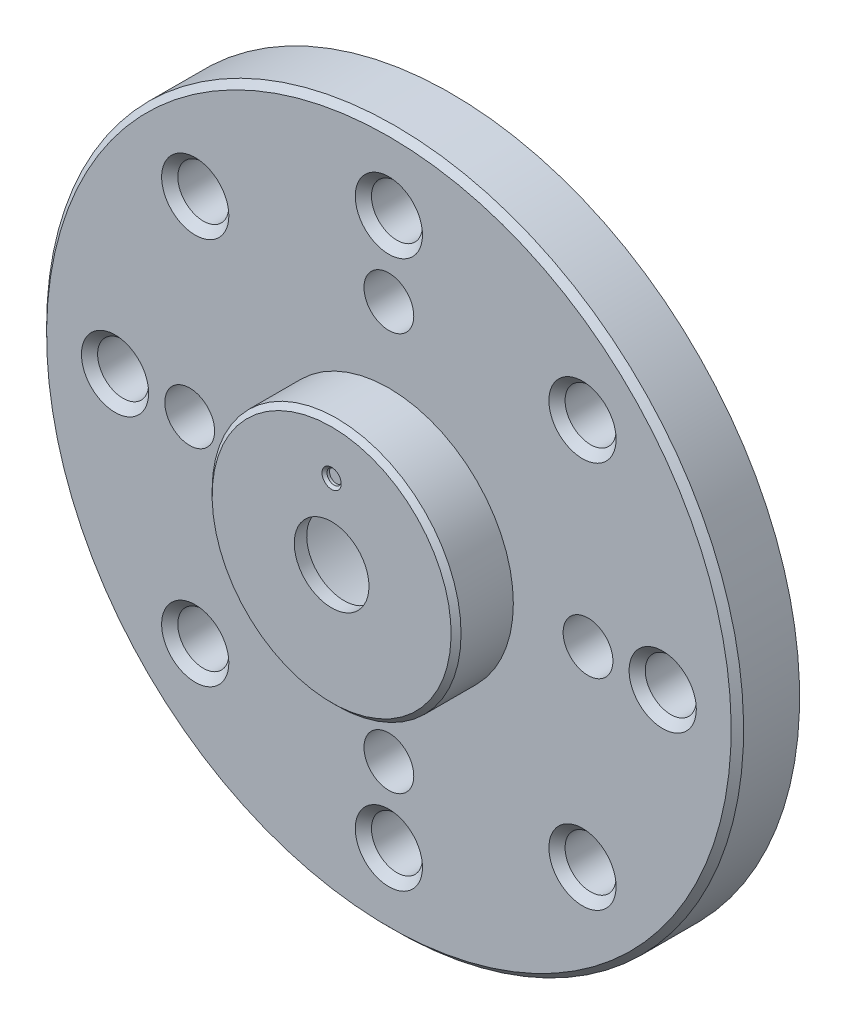
ISO-10303-21;
HEADER;
FILE_DESCRIPTION(('STEP AP214'),'2;1');
FILE_NAME('part.step','',(''),(''),'','','');
FILE_SCHEMA(('AUTOMOTIVE_DESIGN { 1 0 10303 214 1 1 1 1 }'));
ENDSEC;
DATA;
#1=APPLICATION_CONTEXT('core data for automotive mechanical design processes');
#2=APPLICATION_PROTOCOL_DEFINITION('international standard','automotive_design',2000,#1);
#3=PRODUCT_CONTEXT('',#1,'mechanical');
#4=PRODUCT('Part','Part','',(#3));
#5=PRODUCT_RELATED_PRODUCT_CATEGORY('part','',(#4));
#6=PRODUCT_DEFINITION_FORMATION('','',#4);
#7=PRODUCT_DEFINITION_CONTEXT('part definition',#1,'design');
#8=PRODUCT_DEFINITION('design','',#6,#7);
#9=PRODUCT_DEFINITION_SHAPE('','',#8);
#10=(LENGTH_UNIT() NAMED_UNIT(*) SI_UNIT(.MILLI.,.METRE.));
#11=(NAMED_UNIT(*) PLANE_ANGLE_UNIT() SI_UNIT($,.RADIAN.));
#12=(NAMED_UNIT(*) SI_UNIT($,.STERADIAN.) SOLID_ANGLE_UNIT());
#13=UNCERTAINTY_MEASURE_WITH_UNIT(LENGTH_MEASURE(1.E-05),#10,'distance_accuracy_value','');
#14=(GEOMETRIC_REPRESENTATION_CONTEXT(3) GLOBAL_UNCERTAINTY_ASSIGNED_CONTEXT((#13)) GLOBAL_UNIT_ASSIGNED_CONTEXT((#10,
#11,#12)) REPRESENTATION_CONTEXT('',''));
#15=CARTESIAN_POINT('',(0.,0.,0.));
#16=DIRECTION('',(0.,0.,1.));
#17=DIRECTION('',(1.,0.,0.));
#18=AXIS2_PLACEMENT_3D('',#15,#16,#17);
#19=CARTESIAN_POINT('',(-0.288904952,2.716630578,26.6));
#20=DIRECTION('',(0.,0.,1.));
#21=DIRECTION('',(1.,0.,0.));
#22=AXIS2_PLACEMENT_3D('',#19,#20,#21);
#23=PLANE('',#22);
#24=CARTESIAN_POINT('',(0.,3.00553553,26.6));
#25=DIRECTION('',(0.,0.,1.));
#26=DIRECTION('',(0.,-1.,0.));
#27=AXIS2_PLACEMENT_3D('',#24,#25,#26);
#28=CIRCLE('',#27,0.285479202);
#29=CARTESIAN_POINT('',(0.,2.720056328,26.6));
#30=VERTEX_POINT('',#29);
#31=EDGE_CURVE('E19',#30,#30,#28,.F.);
#32=ORIENTED_EDGE('',*,*,#31,.F.);
#33=EDGE_LOOP('',(#32));
#34=FACE_BOUND('',#33,.T.);
#35=ADVANCED_FACE('F15',(#34),#23,.T.);
#36=CARTESIAN_POINT('',(0.,3.00553553,26.6));
#37=DIRECTION('',(0.,0.,1.));
#38=DIRECTION('',(0.,-1.,0.));
#39=AXIS2_PLACEMENT_3D('',#36,#37,#38);
#40=CYLINDRICAL_SURFACE('',#39,0.285479202);
#41=CARTESIAN_POINT('',(0.,3.00553553,26.7000000000001));
#42=DIRECTION('',(0.,0.,1.));
#43=DIRECTION('',(1.,0.,-1.94449020602411E-13));
#44=AXIS2_PLACEMENT_3D('',#41,#42,#43);
#45=CIRCLE('',#44,0.285479202);
#46=CARTESIAN_POINT('',(0.285479202,3.00553553,26.7));
#47=VERTEX_POINT('',#46);
#48=EDGE_CURVE('E35',#47,#47,#45,.F.);
#49=ORIENTED_EDGE('',*,*,#48,.F.);
#50=EDGE_LOOP('',(#49));
#51=FACE_BOUND('',#50,.T.);
#52=ORIENTED_EDGE('',*,*,#31,.T.);
#53=EDGE_LOOP('',(#52));
#54=FACE_BOUND('',#53,.T.);
#55=ADVANCED_FACE('F180',(#51,#54),#40,.F.);
#56=CARTESIAN_POINT('',(3.795,-3.795,26.3));
#57=DIRECTION('',(0.,0.,-1.));
#58=DIRECTION('',(-1.,0.,0.));
#59=AXIS2_PLACEMENT_3D('',#56,#57,#58);
#60=PLANE('',#59);
#61=CARTESIAN_POINT('',(0.,0.,26.3));
#62=DIRECTION('',(0.,0.,-1.));
#63=DIRECTION('',(0.,1.,0.));
#64=AXIS2_PLACEMENT_3D('',#61,#62,#63);
#65=CIRCLE('',#64,1.5);
#66=CARTESIAN_POINT('',(0.,1.5,26.3));
#67=VERTEX_POINT('',#66);
#68=EDGE_CURVE('E166',#67,#67,#65,.T.);
#69=ORIENTED_EDGE('',*,*,#68,.F.);
#70=EDGE_LOOP('',(#69));
#71=FACE_BOUND('',#70,.T.);
#72=CARTESIAN_POINT('',(0.,0.,26.3));
#73=DIRECTION('',(0.,0.,1.));
#74=DIRECTION('',(0.,-1.,0.));
#75=AXIS2_PLACEMENT_3D('',#72,#73,#74);
#76=CIRCLE('',#75,3.75);
#77=CARTESIAN_POINT('',(0.,-3.75,26.3));
#78=VERTEX_POINT('',#77);
#79=EDGE_CURVE('E169',#78,#78,#76,.T.);
#80=ORIENTED_EDGE('',*,*,#79,.F.);
#81=EDGE_LOOP('',(#80));
#82=FACE_BOUND('',#81,.T.);
#83=ADVANCED_FACE('F188',(#71,#82),#60,.T.);
#84=CARTESIAN_POINT('',(0.,0.,21.5));
#85=DIRECTION('',(0.,0.,1.));
#86=DIRECTION('',(0.,-1.,0.));
#87=AXIS2_PLACEMENT_3D('',#84,#85,#86);
#88=CYLINDRICAL_SURFACE('',#87,3.75);
#89=CARTESIAN_POINT('',(0.,0.,21.5));
#90=DIRECTION('',(0.,0.,1.));
#91=DIRECTION('',(0.,-1.,0.));
#92=AXIS2_PLACEMENT_3D('',#89,#90,#91);
#93=CIRCLE('',#92,3.75);
#94=CARTESIAN_POINT('',(0.,-3.75,21.5));
#95=VERTEX_POINT('',#94);
#96=EDGE_CURVE('E162',#95,#95,#93,.T.);
#97=ORIENTED_EDGE('',*,*,#96,.F.);
#98=EDGE_LOOP('',(#97));
#99=FACE_BOUND('',#98,.T.);
#100=ORIENTED_EDGE('',*,*,#79,.T.);
#101=EDGE_LOOP('',(#100));
#102=FACE_BOUND('',#101,.T.);
#103=ADVANCED_FACE('F308',(#99,#102),#88,.F.);
#104=CARTESIAN_POINT('',(0.,3.00553553,26.7));
#105=DIRECTION('',(0.,0.,1.));
#106=DIRECTION('',(1.,0.,0.));
#107=AXIS2_PLACEMENT_3D('',#104,#105,#106);
#108=CONICAL_SURFACE('',#107,0.285479202,0.785398163397452);
#109=CARTESIAN_POINT('',(0.,3.00553553,26.8));
#110=DIRECTION('',(0.,0.,1.));
#111=DIRECTION('',(1.,0.,0.));
#112=AXIS2_PLACEMENT_3D('',#109,#110,#111);
#113=CIRCLE('',#112,0.385479202000043);
#114=CARTESIAN_POINT('',(0.385479202000043,3.00553553,26.8));
#115=VERTEX_POINT('',#114);
#116=EDGE_CURVE('E158',#115,#115,#113,.T.);
#117=ORIENTED_EDGE('',*,*,#116,.T.);
#118=EDGE_LOOP('',(#117));
#119=FACE_BOUND('',#118,.T.);
#120=ORIENTED_EDGE('',*,*,#48,.T.);
#121=EDGE_LOOP('',(#120));
#122=FACE_BOUND('',#121,.T.);
#123=ADVANCED_FACE('F304',(#119,#122),#108,.F.);
#124=CARTESIAN_POINT('',(0.,0.,26.8));
#125=DIRECTION('',(0.,0.,-1.));
#126=DIRECTION('',(0.,1.,0.));
#127=AXIS2_PLACEMENT_3D('',#124,#125,#126);
#128=CYLINDRICAL_SURFACE('',#127,1.5);
#129=CARTESIAN_POINT('',(0.,0.,26.8));
#130=DIRECTION('',(0.,0.,-1.));
#131=DIRECTION('',(0.,1.,0.));
#132=AXIS2_PLACEMENT_3D('',#129,#130,#131);
#133=CIRCLE('',#132,1.5);
#134=CARTESIAN_POINT('',(0.,1.5,26.8));
#135=VERTEX_POINT('',#134);
#136=EDGE_CURVE('E154',#135,#135,#133,.F.);
#137=ORIENTED_EDGE('',*,*,#136,.T.);
#138=EDGE_LOOP('',(#137));
#139=FACE_BOUND('',#138,.T.);
#140=ORIENTED_EDGE('',*,*,#68,.T.);
#141=EDGE_LOOP('',(#140));
#142=FACE_BOUND('',#141,.T.);
#143=ADVANCED_FACE('F300',(#139,#142),#128,.F.);
#144=CARTESIAN_POINT('',(5.06,-5.06,21.5));
#145=DIRECTION('',(0.,0.,-1.));
#146=DIRECTION('',(-1.,0.,0.));
#147=AXIS2_PLACEMENT_3D('',#144,#145,#146);
#148=PLANE('',#147);
#149=ORIENTED_EDGE('',*,*,#96,.T.);
#150=EDGE_LOOP('',(#149));
#151=FACE_BOUND('',#150,.T.);
#152=CARTESIAN_POINT('',(0.,0.,21.5));
#153=DIRECTION('',(0.,0.,1.));
#154=DIRECTION('',(0.,-1.,0.));
#155=AXIS2_PLACEMENT_3D('',#152,#153,#154);
#156=CIRCLE('',#155,5.);
#157=CARTESIAN_POINT('',(0.,-5.,21.5));
#158=VERTEX_POINT('',#157);
#159=EDGE_CURVE('E150',#158,#158,#156,.F.);
#160=ORIENTED_EDGE('',*,*,#159,.T.);
#161=EDGE_LOOP('',(#160));
#162=FACE_BOUND('',#161,.T.);
#163=ADVANCED_FACE('F303',(#151,#162),#148,.T.);
#164=CARTESIAN_POINT('',(4.8576,-4.8576,26.8));
#165=DIRECTION('',(0.,0.,-1.));
#166=DIRECTION('',(-1.,0.,0.));
#167=AXIS2_PLACEMENT_3D('',#164,#165,#166);
#168=PLANE('',#167);
#169=ORIENTED_EDGE('',*,*,#136,.F.);
#170=EDGE_LOOP('',(#169));
#171=FACE_BOUND('',#170,.T.);
#172=ORIENTED_EDGE('',*,*,#116,.F.);
#173=EDGE_LOOP('',(#172));
#174=FACE_BOUND('',#173,.T.);
#175=CARTESIAN_POINT('',(0.,0.,26.8));
#176=DIRECTION('',(0.,0.,-1.));
#177=DIRECTION('',(0.,1.,0.));
#178=AXIS2_PLACEMENT_3D('',#175,#176,#177);
#179=CIRCLE('',#178,4.8);
#180=CARTESIAN_POINT('',(0.,4.8,26.8));
#181=VERTEX_POINT('',#180);
#182=EDGE_CURVE('E146',#181,#181,#179,.F.);
#183=ORIENTED_EDGE('',*,*,#182,.T.);
#184=EDGE_LOOP('',(#183));
#185=FACE_BOUND('',#184,.T.);
#186=ADVANCED_FACE('F298',(#171,#174,#185),#168,.F.);
#187=CARTESIAN_POINT('',(0.,0.,21.5));
#188=DIRECTION('',(0.,0.,1.));
#189=DIRECTION('',(0.,-1.,0.));
#190=AXIS2_PLACEMENT_3D('',#187,#188,#189);
#191=CYLINDRICAL_SURFACE('',#190,5.);
#192=ORIENTED_EDGE('',*,*,#159,.F.);
#193=EDGE_LOOP('',(#192));
#194=FACE_BOUND('',#193,.T.);
#195=CARTESIAN_POINT('',(0.,0.,22.));
#196=DIRECTION('',(0.,0.,1.));
#197=DIRECTION('',(0.,-1.,0.));
#198=AXIS2_PLACEMENT_3D('',#195,#196,#197);
#199=CIRCLE('',#198,5.);
#200=CARTESIAN_POINT('',(0.,-5.,22.));
#201=VERTEX_POINT('',#200);
#202=EDGE_CURVE('E109',#201,#201,#199,.F.);
#203=ORIENTED_EDGE('',*,*,#202,.T.);
#204=EDGE_LOOP('',(#203));
#205=FACE_BOUND('',#204,.T.);
#206=ADVANCED_FACE('F294',(#194,#205),#191,.T.);
#207=CARTESIAN_POINT('',(0.,11.,22.));
#208=DIRECTION('',(0.,0.,1.));
#209=DIRECTION('',(1.,0.,0.));
#210=AXIS2_PLACEMENT_3D('',#207,#208,#209);
#211=CYLINDRICAL_SURFACE('',#210,1.025);
#212=CARTESIAN_POINT('',(0.,11.,22.));
#213=DIRECTION('',(0.,0.,1.));
#214=DIRECTION('',(1.,0.,0.));
#215=AXIS2_PLACEMENT_3D('',#212,#213,#214);
#216=CIRCLE('',#215,1.025);
#217=CARTESIAN_POINT('',(1.025,11.,22.));
#218=VERTEX_POINT('',#217);
#219=EDGE_CURVE('E142',#218,#218,#216,.F.);
#220=ORIENTED_EDGE('',*,*,#219,.T.);
#221=EDGE_LOOP('',(#220));
#222=FACE_BOUND('',#221,.T.);
#223=CARTESIAN_POINT('',(0.,11.,24.1750000000001));
#224=DIRECTION('',(0.,0.,1.));
#225=DIRECTION('',(1.,0.,0.));
#226=AXIS2_PLACEMENT_3D('',#223,#224,#225);
#227=CIRCLE('',#226,1.025);
#228=CARTESIAN_POINT('',(1.025,11.,24.175));
#229=VERTEX_POINT('',#228);
#230=EDGE_CURVE('E113',#229,#229,#227,.F.);
#231=ORIENTED_EDGE('',*,*,#230,.F.);
#232=EDGE_LOOP('',(#231));
#233=FACE_BOUND('',#232,.T.);
#234=ADVANCED_FACE('F290',(#222,#233),#211,.F.);
#235=CARTESIAN_POINT('',(-7.778174593,7.778174593,22.));
#236=DIRECTION('',(0.,0.,1.));
#237=DIRECTION('',(1.,0.,0.));
#238=AXIS2_PLACEMENT_3D('',#235,#236,#237);
#239=CYLINDRICAL_SURFACE('',#238,1.025);
#240=CARTESIAN_POINT('',(-7.778174593,7.778174593,22.));
#241=DIRECTION('',(0.,0.,1.));
#242=DIRECTION('',(1.,0.,0.));
#243=AXIS2_PLACEMENT_3D('',#240,#241,#242);
#244=CIRCLE('',#243,1.025);
#245=CARTESIAN_POINT('',(-6.753174593,7.778174593,22.));
#246=VERTEX_POINT('',#245);
#247=EDGE_CURVE('E114',#246,#246,#244,.F.);
#248=ORIENTED_EDGE('',*,*,#247,.T.);
#249=EDGE_LOOP('',(#248));
#250=FACE_BOUND('',#249,.T.);
#251=CARTESIAN_POINT('',(-7.778174593,7.778174593,24.1750000000001));
#252=DIRECTION('',(0.,0.,1.));
#253=DIRECTION('',(1.,0.,0.));
#254=AXIS2_PLACEMENT_3D('',#251,#252,#253);
#255=CIRCLE('',#254,1.025);
#256=CARTESIAN_POINT('',(-6.753174593,7.778174593,24.175));
#257=VERTEX_POINT('',#256);
#258=EDGE_CURVE('E358',#257,#257,#255,.F.);
#259=ORIENTED_EDGE('',*,*,#258,.F.);
#260=EDGE_LOOP('',(#259));
#261=FACE_BOUND('',#260,.T.);
#262=ADVANCED_FACE('F286',(#250,#261),#239,.F.);
#263=CARTESIAN_POINT('',(-11.,0.,22.));
#264=DIRECTION('',(0.,0.,1.));
#265=DIRECTION('',(1.,0.,0.));
#266=AXIS2_PLACEMENT_3D('',#263,#264,#265);
#267=CYLINDRICAL_SURFACE('',#266,1.025);
#268=CARTESIAN_POINT('',(-11.,0.,22.));
#269=DIRECTION('',(0.,0.,1.));
#270=DIRECTION('',(1.,0.,0.));
#271=AXIS2_PLACEMENT_3D('',#268,#269,#270);
#272=CIRCLE('',#271,1.025);
#273=CARTESIAN_POINT('',(-9.975,0.,22.));
#274=VERTEX_POINT('',#273);
#275=EDGE_CURVE('E138',#274,#274,#272,.F.);
#276=ORIENTED_EDGE('',*,*,#275,.T.);
#277=EDGE_LOOP('',(#276));
#278=FACE_BOUND('',#277,.T.);
#279=CARTESIAN_POINT('',(-11.,0.,24.1750000000001));
#280=DIRECTION('',(0.,0.,1.));
#281=DIRECTION('',(1.,0.,0.));
#282=AXIS2_PLACEMENT_3D('',#279,#280,#281);
#283=CIRCLE('',#282,1.025);
#284=CARTESIAN_POINT('',(-9.975,0.,24.175));
#285=VERTEX_POINT('',#284);
#286=EDGE_CURVE('E361',#285,#285,#283,.F.);
#287=ORIENTED_EDGE('',*,*,#286,.F.);
#288=EDGE_LOOP('',(#287));
#289=FACE_BOUND('',#288,.T.);
#290=ADVANCED_FACE('F282',(#278,#289),#267,.F.);
#291=CARTESIAN_POINT('',(-7.778174593,-7.778174593,22.));
#292=DIRECTION('',(0.,0.,1.));
#293=DIRECTION('',(1.,0.,0.));
#294=AXIS2_PLACEMENT_3D('',#291,#292,#293);
#295=CYLINDRICAL_SURFACE('',#294,1.025);
#296=CARTESIAN_POINT('',(-7.778174593,-7.778174593,22.));
#297=DIRECTION('',(0.,0.,1.));
#298=DIRECTION('',(1.,0.,0.));
#299=AXIS2_PLACEMENT_3D('',#296,#297,#298);
#300=CIRCLE('',#299,1.025);
#301=CARTESIAN_POINT('',(-6.753174593,-7.778174593,22.));
#302=VERTEX_POINT('',#301);
#303=EDGE_CURVE('E118',#302,#302,#300,.F.);
#304=ORIENTED_EDGE('',*,*,#303,.T.);
#305=EDGE_LOOP('',(#304));
#306=FACE_BOUND('',#305,.T.);
#307=CARTESIAN_POINT('',(-7.778174593,-7.778174593,24.1750000000001));
#308=DIRECTION('',(0.,0.,1.));
#309=DIRECTION('',(1.,0.,0.));
#310=AXIS2_PLACEMENT_3D('',#307,#308,#309);
#311=CIRCLE('',#310,1.025);
#312=CARTESIAN_POINT('',(-6.753174593,-7.778174593,24.175));
#313=VERTEX_POINT('',#312);
#314=EDGE_CURVE('E367',#313,#313,#311,.F.);
#315=ORIENTED_EDGE('',*,*,#314,.F.);
#316=EDGE_LOOP('',(#315));
#317=FACE_BOUND('',#316,.T.);
#318=ADVANCED_FACE('F278',(#306,#317),#295,.F.);
#319=CARTESIAN_POINT('',(0.,-11.,22.));
#320=DIRECTION('',(0.,0.,1.));
#321=DIRECTION('',(1.,0.,0.));
#322=AXIS2_PLACEMENT_3D('',#319,#320,#321);
#323=CYLINDRICAL_SURFACE('',#322,1.025);
#324=CARTESIAN_POINT('',(0.,-11.,22.));
#325=DIRECTION('',(0.,0.,1.));
#326=DIRECTION('',(1.,0.,0.));
#327=AXIS2_PLACEMENT_3D('',#324,#325,#326);
#328=CIRCLE('',#327,1.025);
#329=CARTESIAN_POINT('',(1.025,-11.,22.));
#330=VERTEX_POINT('',#329);
#331=EDGE_CURVE('E134',#330,#330,#328,.F.);
#332=ORIENTED_EDGE('',*,*,#331,.T.);
#333=EDGE_LOOP('',(#332));
#334=FACE_BOUND('',#333,.T.);
#335=CARTESIAN_POINT('',(0.,-11.,24.1750000000001));
#336=DIRECTION('',(0.,0.,1.));
#337=DIRECTION('',(1.,0.,0.));
#338=AXIS2_PLACEMENT_3D('',#335,#336,#337);
#339=CIRCLE('',#338,1.025);
#340=CARTESIAN_POINT('',(1.025,-11.,24.175));
#341=VERTEX_POINT('',#340);
#342=EDGE_CURVE('E371',#341,#341,#339,.F.);
#343=ORIENTED_EDGE('',*,*,#342,.F.);
#344=EDGE_LOOP('',(#343));
#345=FACE_BOUND('',#344,.T.);
#346=ADVANCED_FACE('F274',(#334,#345),#323,.F.);
#347=CARTESIAN_POINT('',(7.778174593,-7.778174593,22.));
#348=DIRECTION('',(0.,0.,1.));
#349=DIRECTION('',(1.,0.,0.));
#350=AXIS2_PLACEMENT_3D('',#347,#348,#349);
#351=CYLINDRICAL_SURFACE('',#350,1.025);
#352=CARTESIAN_POINT('',(7.778174593,-7.778174593,22.));
#353=DIRECTION('',(0.,0.,1.));
#354=DIRECTION('',(1.,0.,0.));
#355=AXIS2_PLACEMENT_3D('',#352,#353,#354);
#356=CIRCLE('',#355,1.025);
#357=CARTESIAN_POINT('',(8.803174593,-7.778174593,22.));
#358=VERTEX_POINT('',#357);
#359=EDGE_CURVE('E122',#358,#358,#356,.F.);
#360=ORIENTED_EDGE('',*,*,#359,.T.);
#361=EDGE_LOOP('',(#360));
#362=FACE_BOUND('',#361,.T.);
#363=CARTESIAN_POINT('',(7.778174593,-7.778174593,24.1750000000001));
#364=DIRECTION('',(0.,0.,1.));
#365=DIRECTION('',(1.,0.,0.));
#366=AXIS2_PLACEMENT_3D('',#363,#364,#365);
#367=CIRCLE('',#366,1.025);
#368=CARTESIAN_POINT('',(8.803174593,-7.778174593,24.175));
#369=VERTEX_POINT('',#368);
#370=EDGE_CURVE('E375',#369,#369,#367,.F.);
#371=ORIENTED_EDGE('',*,*,#370,.F.);
#372=EDGE_LOOP('',(#371));
#373=FACE_BOUND('',#372,.T.);
#374=ADVANCED_FACE('F270',(#362,#373),#351,.F.);
#375=CARTESIAN_POINT('',(11.,0.,22.));
#376=DIRECTION('',(0.,0.,1.));
#377=DIRECTION('',(1.,0.,0.));
#378=AXIS2_PLACEMENT_3D('',#375,#376,#377);
#379=CYLINDRICAL_SURFACE('',#378,1.025);
#380=CARTESIAN_POINT('',(11.,0.,22.));
#381=DIRECTION('',(0.,0.,1.));
#382=DIRECTION('',(1.,0.,0.));
#383=AXIS2_PLACEMENT_3D('',#380,#381,#382);
#384=CIRCLE('',#383,1.025);
#385=CARTESIAN_POINT('',(12.025,0.,22.));
#386=VERTEX_POINT('',#385);
#387=EDGE_CURVE('E130',#386,#386,#384,.F.);
#388=ORIENTED_EDGE('',*,*,#387,.T.);
#389=EDGE_LOOP('',(#388));
#390=FACE_BOUND('',#389,.T.);
#391=CARTESIAN_POINT('',(11.,0.,24.1750000000001));
#392=DIRECTION('',(0.,0.,1.));
#393=DIRECTION('',(1.,0.,0.));
#394=AXIS2_PLACEMENT_3D('',#391,#392,#393);
#395=CIRCLE('',#394,1.025);
#396=CARTESIAN_POINT('',(12.025,0.,24.175));
#397=VERTEX_POINT('',#396);
#398=EDGE_CURVE('E379',#397,#397,#395,.F.);
#399=ORIENTED_EDGE('',*,*,#398,.F.);
#400=EDGE_LOOP('',(#399));
#401=FACE_BOUND('',#400,.T.);
#402=ADVANCED_FACE('F266',(#390,#401),#379,.F.);
#403=CARTESIAN_POINT('',(7.778174593,7.778174593,22.));
#404=DIRECTION('',(0.,0.,1.));
#405=DIRECTION('',(1.,0.,0.));
#406=AXIS2_PLACEMENT_3D('',#403,#404,#405);
#407=CYLINDRICAL_SURFACE('',#406,1.025);
#408=CARTESIAN_POINT('',(7.778174593,7.778174593,22.));
#409=DIRECTION('',(0.,0.,1.));
#410=DIRECTION('',(1.,0.,0.));
#411=AXIS2_PLACEMENT_3D('',#408,#409,#410);
#412=CIRCLE('',#411,1.025);
#413=CARTESIAN_POINT('',(8.803174593,7.778174593,22.));
#414=VERTEX_POINT('',#413);
#415=EDGE_CURVE('E126',#414,#414,#412,.F.);
#416=ORIENTED_EDGE('',*,*,#415,.T.);
#417=EDGE_LOOP('',(#416));
#418=FACE_BOUND('',#417,.T.);
#419=CARTESIAN_POINT('',(7.778174593,7.778174593,24.1750000000001));
#420=DIRECTION('',(0.,0.,1.));
#421=DIRECTION('',(1.,0.,0.));
#422=AXIS2_PLACEMENT_3D('',#419,#420,#421);
#423=CIRCLE('',#422,1.025);
#424=CARTESIAN_POINT('',(8.803174593,7.778174593,24.175));
#425=VERTEX_POINT('',#424);
#426=EDGE_CURVE('E383',#425,#425,#423,.F.);
#427=ORIENTED_EDGE('',*,*,#426,.F.);
#428=EDGE_LOOP('',(#427));
#429=FACE_BOUND('',#428,.T.);
#430=ADVANCED_FACE('F262',(#418,#429),#407,.F.);
#431=CARTESIAN_POINT('',(0.,0.,26.8));
#432=DIRECTION('',(0.,0.,-1.));
#433=DIRECTION('',(0.,1.,0.));
#434=AXIS2_PLACEMENT_3D('',#431,#432,#433);
#435=CONICAL_SURFACE('',#434,4.8,0.785398163397453);
#436=ORIENTED_EDGE('',*,*,#182,.F.);
#437=EDGE_LOOP('',(#436));
#438=FACE_BOUND('',#437,.T.);
#439=CARTESIAN_POINT('',(0.,0.,26.6));
#440=DIRECTION('',(0.,0.,-1.));
#441=DIRECTION('',(-1.,0.,0.));
#442=AXIS2_PLACEMENT_3D('',#439,#440,#441);
#443=CIRCLE('',#442,5.);
#444=CARTESIAN_POINT('',(-5.,0.,26.6));
#445=VERTEX_POINT('',#444);
#446=EDGE_CURVE('E108',#445,#445,#443,.F.);
#447=ORIENTED_EDGE('',*,*,#446,.T.);
#448=EDGE_LOOP('',(#447));
#449=FACE_BOUND('',#448,.T.);
#450=ADVANCED_FACE('F259',(#438,#449),#435,.T.);
#451=CARTESIAN_POINT('',(-14.168,-14.168,22.));
#452=DIRECTION('',(0.,0.,1.));
#453=DIRECTION('',(1.,0.,0.));
#454=AXIS2_PLACEMENT_3D('',#451,#452,#453);
#455=PLANE('',#454);
#456=ORIENTED_EDGE('',*,*,#202,.F.);
#457=EDGE_LOOP('',(#456));
#458=FACE_BOUND('',#457,.T.);
#459=ORIENTED_EDGE('',*,*,#247,.F.);
#460=EDGE_LOOP('',(#459));
#461=FACE_BOUND('',#460,.T.);
#462=ORIENTED_EDGE('',*,*,#303,.F.);
#463=EDGE_LOOP('',(#462));
#464=FACE_BOUND('',#463,.T.);
#465=ORIENTED_EDGE('',*,*,#359,.F.);
#466=EDGE_LOOP('',(#465));
#467=FACE_BOUND('',#466,.T.);
#468=ORIENTED_EDGE('',*,*,#415,.F.);
#469=EDGE_LOOP('',(#468));
#470=FACE_BOUND('',#469,.T.);
#471=CARTESIAN_POINT('',(8.,0.,22.));
#472=DIRECTION('',(0.,0.,1.));
#473=DIRECTION('',(1.,0.,0.));
#474=AXIS2_PLACEMENT_3D('',#471,#472,#473);
#475=CIRCLE('',#474,1.);
#476=CARTESIAN_POINT('',(9.,0.,22.));
#477=VERTEX_POINT('',#476);
#478=EDGE_CURVE('E100',#477,#477,#475,.F.);
#479=ORIENTED_EDGE('',*,*,#478,.F.);
#480=EDGE_LOOP('',(#479));
#481=FACE_BOUND('',#480,.T.);
#482=CARTESIAN_POINT('',(0.,-8.,22.));
#483=DIRECTION('',(0.,0.,1.));
#484=DIRECTION('',(1.,0.,0.));
#485=AXIS2_PLACEMENT_3D('',#482,#483,#484);
#486=CIRCLE('',#485,1.);
#487=CARTESIAN_POINT('',(1.,-8.,22.));
#488=VERTEX_POINT('',#487);
#489=EDGE_CURVE('E92',#488,#488,#486,.F.);
#490=ORIENTED_EDGE('',*,*,#489,.F.);
#491=EDGE_LOOP('',(#490));
#492=FACE_BOUND('',#491,.T.);
#493=CARTESIAN_POINT('',(-8.,0.,22.));
#494=DIRECTION('',(0.,0.,1.));
#495=DIRECTION('',(1.,0.,0.));
#496=AXIS2_PLACEMENT_3D('',#493,#494,#495);
#497=CIRCLE('',#496,1.);
#498=CARTESIAN_POINT('',(-7.,0.,22.));
#499=VERTEX_POINT('',#498);
#500=EDGE_CURVE('E96',#499,#499,#497,.F.);
#501=ORIENTED_EDGE('',*,*,#500,.F.);
#502=EDGE_LOOP('',(#501));
#503=FACE_BOUND('',#502,.T.);
#504=CARTESIAN_POINT('',(0.,8.,22.));
#505=DIRECTION('',(0.,0.,1.));
#506=DIRECTION('',(1.,0.,0.));
#507=AXIS2_PLACEMENT_3D('',#504,#505,#506);
#508=CIRCLE('',#507,1.);
#509=CARTESIAN_POINT('',(1.,8.,22.));
#510=VERTEX_POINT('',#509);
#511=EDGE_CURVE('E104',#510,#510,#508,.F.);
#512=ORIENTED_EDGE('',*,*,#511,.F.);
#513=EDGE_LOOP('',(#512));
#514=FACE_BOUND('',#513,.T.);
#515=ORIENTED_EDGE('',*,*,#387,.F.);
#516=EDGE_LOOP('',(#515));
#517=FACE_BOUND('',#516,.T.);
#518=ORIENTED_EDGE('',*,*,#331,.F.);
#519=EDGE_LOOP('',(#518));
#520=FACE_BOUND('',#519,.T.);
#521=ORIENTED_EDGE('',*,*,#275,.F.);
#522=EDGE_LOOP('',(#521));
#523=FACE_BOUND('',#522,.T.);
#524=ORIENTED_EDGE('',*,*,#219,.F.);
#525=EDGE_LOOP('',(#524));
#526=FACE_BOUND('',#525,.T.);
#527=CARTESIAN_POINT('',(0.,0.,22.));
#528=DIRECTION('',(0.,0.,-1.));
#529=DIRECTION('',(-1.,0.,0.));
#530=AXIS2_PLACEMENT_3D('',#527,#528,#529);
#531=CIRCLE('',#530,14.);
#532=CARTESIAN_POINT('',(-14.,0.,22.));
#533=VERTEX_POINT('',#532);
#534=EDGE_CURVE('E88',#533,#533,#531,.T.);
#535=ORIENTED_EDGE('',*,*,#534,.T.);
#536=EDGE_LOOP('',(#535));
#537=FACE_BOUND('',#536,.T.);
#538=ADVANCED_FACE('F257',(#458,#461,#464,#467,#470,#481,#492,#503,#514,#517,#520,#523,#526,
#537),#455,.F.);
#539=CARTESIAN_POINT('',(0.,11.,24.175));
#540=DIRECTION('',(0.,0.,1.));
#541=DIRECTION('',(1.,0.,0.));
#542=AXIS2_PLACEMENT_3D('',#539,#540,#541);
#543=CONICAL_SURFACE('',#542,1.025,0.78539816339745);
#544=ORIENTED_EDGE('',*,*,#230,.T.);
#545=EDGE_LOOP('',(#544));
#546=FACE_BOUND('',#545,.T.);
#547=CARTESIAN_POINT('',(0.,11.,24.5));
#548=DIRECTION('',(0.,0.,1.));
#549=DIRECTION('',(1.,0.,0.));
#550=AXIS2_PLACEMENT_3D('',#547,#548,#549);
#551=CIRCLE('',#550,1.34999999999997);
#552=CARTESIAN_POINT('',(1.34999999999997,11.,24.5));
#553=VERTEX_POINT('',#552);
#554=EDGE_CURVE('E84',#553,#553,#551,.T.);
#555=ORIENTED_EDGE('',*,*,#554,.T.);
#556=EDGE_LOOP('',(#555));
#557=FACE_BOUND('',#556,.T.);
#558=ADVANCED_FACE('F253',(#546,#557),#543,.F.);
#559=CARTESIAN_POINT('',(-7.778174593,7.778174593,24.175));
#560=DIRECTION('',(0.,0.,1.));
#561=DIRECTION('',(1.,0.,0.));
#562=AXIS2_PLACEMENT_3D('',#559,#560,#561);
#563=CONICAL_SURFACE('',#562,1.025,0.78539816339745);
#564=ORIENTED_EDGE('',*,*,#258,.T.);
#565=EDGE_LOOP('',(#564));
#566=FACE_BOUND('',#565,.T.);
#567=CARTESIAN_POINT('',(-7.778174593,7.778174593,24.5));
#568=DIRECTION('',(0.,0.,1.));
#569=DIRECTION('',(1.,0.,0.));
#570=AXIS2_PLACEMENT_3D('',#567,#568,#569);
#571=CIRCLE('',#570,1.34999999999997);
#572=CARTESIAN_POINT('',(-6.42817459300003,7.778174593,24.5));
#573=VERTEX_POINT('',#572);
#574=EDGE_CURVE('E80',#573,#573,#571,.T.);
#575=ORIENTED_EDGE('',*,*,#574,.T.);
#576=EDGE_LOOP('',(#575));
#577=FACE_BOUND('',#576,.T.);
#578=ADVANCED_FACE('F249',(#566,#577),#563,.F.);
#579=CARTESIAN_POINT('',(-11.,0.,24.175));
#580=DIRECTION('',(0.,0.,1.));
#581=DIRECTION('',(1.,0.,0.));
#582=AXIS2_PLACEMENT_3D('',#579,#580,#581);
#583=CONICAL_SURFACE('',#582,1.025,0.785398163397451);
#584=ORIENTED_EDGE('',*,*,#286,.T.);
#585=EDGE_LOOP('',(#584));
#586=FACE_BOUND('',#585,.T.);
#587=CARTESIAN_POINT('',(-11.,0.,24.5));
#588=DIRECTION('',(0.,0.,1.));
#589=DIRECTION('',(1.,0.,0.));
#590=AXIS2_PLACEMENT_3D('',#587,#588,#589);
#591=CIRCLE('',#590,1.34999999999996);
#592=CARTESIAN_POINT('',(-9.65000000000004,0.,24.5));
#593=VERTEX_POINT('',#592);
#594=EDGE_CURVE('E76',#593,#593,#591,.T.);
#595=ORIENTED_EDGE('',*,*,#594,.T.);
#596=EDGE_LOOP('',(#595));
#597=FACE_BOUND('',#596,.T.);
#598=ADVANCED_FACE('F245',(#586,#597),#583,.F.);
#599=CARTESIAN_POINT('',(-7.778174593,-7.778174593,24.175));
#600=DIRECTION('',(0.,0.,1.));
#601=DIRECTION('',(1.,0.,0.));
#602=AXIS2_PLACEMENT_3D('',#599,#600,#601);
#603=CONICAL_SURFACE('',#602,1.025,0.78539816339745);
#604=ORIENTED_EDGE('',*,*,#314,.T.);
#605=EDGE_LOOP('',(#604));
#606=FACE_BOUND('',#605,.T.);
#607=CARTESIAN_POINT('',(-7.778174593,-7.778174593,24.5));
#608=DIRECTION('',(0.,0.,1.));
#609=DIRECTION('',(1.,0.,0.));
#610=AXIS2_PLACEMENT_3D('',#607,#608,#609);
#611=CIRCLE('',#610,1.34999999999997);
#612=CARTESIAN_POINT('',(-6.42817459300003,-7.778174593,24.5));
#613=VERTEX_POINT('',#612);
#614=EDGE_CURVE('E72',#613,#613,#611,.T.);
#615=ORIENTED_EDGE('',*,*,#614,.T.);
#616=EDGE_LOOP('',(#615));
#617=FACE_BOUND('',#616,.T.);
#618=ADVANCED_FACE('F241',(#606,#617),#603,.F.);
#619=CARTESIAN_POINT('',(0.,-11.,24.175));
#620=DIRECTION('',(0.,0.,1.));
#621=DIRECTION('',(1.,0.,0.));
#622=AXIS2_PLACEMENT_3D('',#619,#620,#621);
#623=CONICAL_SURFACE('',#622,1.025,0.78539816339745);
#624=ORIENTED_EDGE('',*,*,#342,.T.);
#625=EDGE_LOOP('',(#624));
#626=FACE_BOUND('',#625,.T.);
#627=CARTESIAN_POINT('',(0.,-11.,24.5));
#628=DIRECTION('',(0.,0.,1.));
#629=DIRECTION('',(1.,0.,0.));
#630=AXIS2_PLACEMENT_3D('',#627,#628,#629);
#631=CIRCLE('',#630,1.34999999999997);
#632=CARTESIAN_POINT('',(1.34999999999997,-11.,24.5));
#633=VERTEX_POINT('',#632);
#634=EDGE_CURVE('E68',#633,#633,#631,.T.);
#635=ORIENTED_EDGE('',*,*,#634,.T.);
#636=EDGE_LOOP('',(#635));
#637=FACE_BOUND('',#636,.T.);
#638=ADVANCED_FACE('F237',(#626,#637),#623,.F.);
#639=CARTESIAN_POINT('',(7.778174593,-7.778174593,24.175));
#640=DIRECTION('',(0.,0.,1.));
#641=DIRECTION('',(1.,0.,0.));
#642=AXIS2_PLACEMENT_3D('',#639,#640,#641);
#643=CONICAL_SURFACE('',#642,1.025,0.785398163397446);
#644=ORIENTED_EDGE('',*,*,#370,.T.);
#645=EDGE_LOOP('',(#644));
#646=FACE_BOUND('',#645,.T.);
#647=CARTESIAN_POINT('',(7.778174593,-7.778174593,24.5));
#648=DIRECTION('',(0.,0.,1.));
#649=DIRECTION('',(1.,0.,0.));
#650=AXIS2_PLACEMENT_3D('',#647,#648,#649);
#651=CIRCLE('',#650,1.34999999999996);
#652=CARTESIAN_POINT('',(9.12817459299997,-7.778174593,24.5));
#653=VERTEX_POINT('',#652);
#654=EDGE_CURVE('E64',#653,#653,#651,.T.);
#655=ORIENTED_EDGE('',*,*,#654,.T.);
#656=EDGE_LOOP('',(#655));
#657=FACE_BOUND('',#656,.T.);
#658=ADVANCED_FACE('F233',(#646,#657),#643,.F.);
#659=CARTESIAN_POINT('',(11.,0.,24.175));
#660=DIRECTION('',(0.,0.,1.));
#661=DIRECTION('',(1.,0.,0.));
#662=AXIS2_PLACEMENT_3D('',#659,#660,#661);
#663=CONICAL_SURFACE('',#662,1.025,0.785398163397451);
#664=ORIENTED_EDGE('',*,*,#398,.T.);
#665=EDGE_LOOP('',(#664));
#666=FACE_BOUND('',#665,.T.);
#667=CARTESIAN_POINT('',(11.,0.,24.5));
#668=DIRECTION('',(0.,0.,1.));
#669=DIRECTION('',(1.,0.,0.));
#670=AXIS2_PLACEMENT_3D('',#667,#668,#669);
#671=CIRCLE('',#670,1.34999999999997);
#672=CARTESIAN_POINT('',(12.35,0.,24.5));
#673=VERTEX_POINT('',#672);
#674=EDGE_CURVE('E60',#673,#673,#671,.T.);
#675=ORIENTED_EDGE('',*,*,#674,.T.);
#676=EDGE_LOOP('',(#675));
#677=FACE_BOUND('',#676,.T.);
#678=ADVANCED_FACE('F229',(#666,#677),#663,.F.);
#679=CARTESIAN_POINT('',(7.778174593,7.778174593,24.175));
#680=DIRECTION('',(0.,0.,1.));
#681=DIRECTION('',(1.,0.,0.));
#682=AXIS2_PLACEMENT_3D('',#679,#680,#681);
#683=CONICAL_SURFACE('',#682,1.025,0.785398163397446);
#684=ORIENTED_EDGE('',*,*,#426,.T.);
#685=EDGE_LOOP('',(#684));
#686=FACE_BOUND('',#685,.T.);
#687=CARTESIAN_POINT('',(7.778174593,7.778174593,24.5));
#688=DIRECTION('',(0.,0.,1.));
#689=DIRECTION('',(1.,0.,0.));
#690=AXIS2_PLACEMENT_3D('',#687,#688,#689);
#691=CIRCLE('',#690,1.34999999999996);
#692=CARTESIAN_POINT('',(9.12817459299997,7.778174593,24.5));
#693=VERTEX_POINT('',#692);
#694=EDGE_CURVE('E56',#693,#693,#691,.T.);
#695=ORIENTED_EDGE('',*,*,#694,.T.);
#696=EDGE_LOOP('',(#695));
#697=FACE_BOUND('',#696,.T.);
#698=ADVANCED_FACE('F225',(#686,#697),#683,.F.);
#699=CARTESIAN_POINT('',(0.,0.,26.6));
#700=DIRECTION('',(0.,0.,-1.));
#701=DIRECTION('',(0.,1.,0.));
#702=AXIS2_PLACEMENT_3D('',#699,#700,#701);
#703=CYLINDRICAL_SURFACE('',#702,5.);
#704=ORIENTED_EDGE('',*,*,#446,.F.);
#705=EDGE_LOOP('',(#704));
#706=FACE_BOUND('',#705,.T.);
#707=CARTESIAN_POINT('',(0.,0.,24.5));
#708=DIRECTION('',(0.,0.,-1.));
#709=DIRECTION('',(0.,1.,0.));
#710=AXIS2_PLACEMENT_3D('',#707,#708,#709);
#711=CIRCLE('',#710,5.);
#712=CARTESIAN_POINT('',(0.,5.,24.5));
#713=VERTEX_POINT('',#712);
#714=EDGE_CURVE('E52',#713,#713,#711,.F.);
#715=ORIENTED_EDGE('',*,*,#714,.T.);
#716=EDGE_LOOP('',(#715));
#717=FACE_BOUND('',#716,.T.);
#718=ADVANCED_FACE('F221',(#706,#717),#703,.T.);
#719=CARTESIAN_POINT('',(0.,8.,22.));
#720=DIRECTION('',(0.,0.,1.));
#721=DIRECTION('',(1.,0.,0.));
#722=AXIS2_PLACEMENT_3D('',#719,#720,#721);
#723=CYLINDRICAL_SURFACE('',#722,1.);
#724=ORIENTED_EDGE('',*,*,#511,.T.);
#725=EDGE_LOOP('',(#724));
#726=FACE_BOUND('',#725,.T.);
#727=CARTESIAN_POINT('',(0.,8.,24.5));
#728=DIRECTION('',(0.,0.,1.));
#729=DIRECTION('',(1.,0.,0.));
#730=AXIS2_PLACEMENT_3D('',#727,#728,#729);
#731=CIRCLE('',#730,1.);
#732=CARTESIAN_POINT('',(1.,8.,24.5));
#733=VERTEX_POINT('',#732);
#734=EDGE_CURVE('E48',#733,#733,#731,.T.);
#735=ORIENTED_EDGE('',*,*,#734,.T.);
#736=EDGE_LOOP('',(#735));
#737=FACE_BOUND('',#736,.T.);
#738=ADVANCED_FACE('F217',(#726,#737),#723,.F.);
#739=CARTESIAN_POINT('',(8.,0.,22.));
#740=DIRECTION('',(0.,0.,1.));
#741=DIRECTION('',(1.,0.,0.));
#742=AXIS2_PLACEMENT_3D('',#739,#740,#741);
#743=CYLINDRICAL_SURFACE('',#742,1.);
#744=ORIENTED_EDGE('',*,*,#478,.T.);
#745=EDGE_LOOP('',(#744));
#746=FACE_BOUND('',#745,.T.);
#747=CARTESIAN_POINT('',(8.,0.,24.5));
#748=DIRECTION('',(0.,0.,1.));
#749=DIRECTION('',(1.,0.,0.));
#750=AXIS2_PLACEMENT_3D('',#747,#748,#749);
#751=CIRCLE('',#750,1.);
#752=CARTESIAN_POINT('',(9.,0.,24.5));
#753=VERTEX_POINT('',#752);
#754=EDGE_CURVE('E44',#753,#753,#751,.T.);
#755=ORIENTED_EDGE('',*,*,#754,.T.);
#756=EDGE_LOOP('',(#755));
#757=FACE_BOUND('',#756,.T.);
#758=ADVANCED_FACE('F213',(#746,#757),#743,.F.);
#759=CARTESIAN_POINT('',(-8.,0.,22.));
#760=DIRECTION('',(0.,0.,1.));
#761=DIRECTION('',(1.,0.,0.));
#762=AXIS2_PLACEMENT_3D('',#759,#760,#761);
#763=CYLINDRICAL_SURFACE('',#762,1.);
#764=ORIENTED_EDGE('',*,*,#500,.T.);
#765=EDGE_LOOP('',(#764));
#766=FACE_BOUND('',#765,.T.);
#767=CARTESIAN_POINT('',(-8.,0.,24.5));
#768=DIRECTION('',(0.,0.,1.));
#769=DIRECTION('',(1.,0.,0.));
#770=AXIS2_PLACEMENT_3D('',#767,#768,#769);
#771=CIRCLE('',#770,1.);
#772=CARTESIAN_POINT('',(-7.,0.,24.5));
#773=VERTEX_POINT('',#772);
#774=EDGE_CURVE('E40',#773,#773,#771,.T.);
#775=ORIENTED_EDGE('',*,*,#774,.T.);
#776=EDGE_LOOP('',(#775));
#777=FACE_BOUND('',#776,.T.);
#778=ADVANCED_FACE('F209',(#766,#777),#763,.F.);
#779=CARTESIAN_POINT('',(0.,-8.,22.));
#780=DIRECTION('',(0.,0.,1.));
#781=DIRECTION('',(1.,0.,0.));
#782=AXIS2_PLACEMENT_3D('',#779,#780,#781);
#783=CYLINDRICAL_SURFACE('',#782,1.);
#784=ORIENTED_EDGE('',*,*,#489,.T.);
#785=EDGE_LOOP('',(#784));
#786=FACE_BOUND('',#785,.T.);
#787=CARTESIAN_POINT('',(0.,-8.,24.5));
#788=DIRECTION('',(0.,0.,1.));
#789=DIRECTION('',(1.,0.,0.));
#790=AXIS2_PLACEMENT_3D('',#787,#788,#789);
#791=CIRCLE('',#790,1.);
#792=CARTESIAN_POINT('',(1.,-8.,24.5));
#793=VERTEX_POINT('',#792);
#794=EDGE_CURVE('E31',#793,#793,#791,.T.);
#795=ORIENTED_EDGE('',*,*,#794,.T.);
#796=EDGE_LOOP('',(#795));
#797=FACE_BOUND('',#796,.T.);
#798=ADVANCED_FACE('F205',(#786,#797),#783,.F.);
#799=CARTESIAN_POINT('',(0.,0.,24.25));
#800=DIRECTION('',(0.,0.,-1.));
#801=DIRECTION('',(-1.,0.,0.));
#802=AXIS2_PLACEMENT_3D('',#799,#800,#801);
#803=CYLINDRICAL_SURFACE('',#802,14.);
#804=ORIENTED_EDGE('',*,*,#534,.F.);
#805=EDGE_LOOP('',(#804));
#806=FACE_BOUND('',#805,.T.);
#807=CARTESIAN_POINT('',(0.,0.,24.2500000000001));
#808=DIRECTION('',(0.,0.,-1.));
#809=DIRECTION('',(-1.,0.,0.));
#810=AXIS2_PLACEMENT_3D('',#807,#808,#809);
#811=CIRCLE('',#810,14.);
#812=CARTESIAN_POINT('',(-14.,0.,24.25));
#813=VERTEX_POINT('',#812);
#814=EDGE_CURVE('E24',#813,#813,#811,.T.);
#815=ORIENTED_EDGE('',*,*,#814,.T.);
#816=EDGE_LOOP('',(#815));
#817=FACE_BOUND('',#816,.T.);
#818=ADVANCED_FACE('F199',(#806,#817),#803,.T.);
#819=CARTESIAN_POINT('',(13.915,-13.915,24.5));
#820=DIRECTION('',(0.,0.,-1.));
#821=DIRECTION('',(-1.,0.,0.));
#822=AXIS2_PLACEMENT_3D('',#819,#820,#821);
#823=PLANE('',#822);
#824=ORIENTED_EDGE('',*,*,#794,.F.);
#825=EDGE_LOOP('',(#824));
#826=FACE_BOUND('',#825,.T.);
#827=ORIENTED_EDGE('',*,*,#774,.F.);
#828=EDGE_LOOP('',(#827));
#829=FACE_BOUND('',#828,.T.);
#830=ORIENTED_EDGE('',*,*,#754,.F.);
#831=EDGE_LOOP('',(#830));
#832=FACE_BOUND('',#831,.T.);
#833=ORIENTED_EDGE('',*,*,#734,.F.);
#834=EDGE_LOOP('',(#833));
#835=FACE_BOUND('',#834,.T.);
#836=ORIENTED_EDGE('',*,*,#714,.F.);
#837=EDGE_LOOP('',(#836));
#838=FACE_BOUND('',#837,.T.);
#839=ORIENTED_EDGE('',*,*,#694,.F.);
#840=EDGE_LOOP('',(#839));
#841=FACE_BOUND('',#840,.T.);
#842=ORIENTED_EDGE('',*,*,#674,.F.);
#843=EDGE_LOOP('',(#842));
#844=FACE_BOUND('',#843,.T.);
#845=ORIENTED_EDGE('',*,*,#654,.F.);
#846=EDGE_LOOP('',(#845));
#847=FACE_BOUND('',#846,.T.);
#848=ORIENTED_EDGE('',*,*,#634,.F.);
#849=EDGE_LOOP('',(#848));
#850=FACE_BOUND('',#849,.T.);
#851=ORIENTED_EDGE('',*,*,#614,.F.);
#852=EDGE_LOOP('',(#851));
#853=FACE_BOUND('',#852,.T.);
#854=ORIENTED_EDGE('',*,*,#594,.F.);
#855=EDGE_LOOP('',(#854));
#856=FACE_BOUND('',#855,.T.);
#857=ORIENTED_EDGE('',*,*,#574,.F.);
#858=EDGE_LOOP('',(#857));
#859=FACE_BOUND('',#858,.T.);
#860=ORIENTED_EDGE('',*,*,#554,.F.);
#861=EDGE_LOOP('',(#860));
#862=FACE_BOUND('',#861,.T.);
#863=CARTESIAN_POINT('',(0.,0.,24.5));
#864=DIRECTION('',(0.,0.,-1.));
#865=DIRECTION('',(0.,1.,0.));
#866=AXIS2_PLACEMENT_3D('',#863,#864,#865);
#867=CIRCLE('',#866,13.75);
#868=CARTESIAN_POINT('',(0.,13.75,24.5));
#869=VERTEX_POINT('',#868);
#870=EDGE_CURVE('E10',#869,#869,#867,.F.);
#871=ORIENTED_EDGE('',*,*,#870,.T.);
#872=EDGE_LOOP('',(#871));
#873=FACE_BOUND('',#872,.T.);
#874=ADVANCED_FACE('F17',(#826,#829,#832,#835,#838,#841,#844,#847,#850,#853,#856,#859,#862,
#873),#823,.F.);
#875=CARTESIAN_POINT('',(0.,0.,24.5));
#876=DIRECTION('',(0.,0.,-1.));
#877=DIRECTION('',(0.,1.,0.));
#878=AXIS2_PLACEMENT_3D('',#875,#876,#877);
#879=CONICAL_SURFACE('',#878,13.75,0.785398163397448);
#880=ORIENTED_EDGE('',*,*,#870,.F.);
#881=EDGE_LOOP('',(#880));
#882=FACE_BOUND('',#881,.T.);
#883=ORIENTED_EDGE('',*,*,#814,.F.);
#884=EDGE_LOOP('',(#883));
#885=FACE_BOUND('',#884,.T.);
#886=ADVANCED_FACE('F192',(#882,#885),#879,.T.);
#887=CLOSED_SHELL('',(#35,#55,#83,#103,#123,#143,#163,#186,#206,#234,#262,#290,#318,#346,#374,
#402,#430,#450,#538,#558,#578,#598,#618,#638,#658,#678,#698,#718,#738,#758,#778,#798,#818,#874,#886));
#888=MANIFOLD_SOLID_BREP('B1',#887);
#889=ADVANCED_BREP_SHAPE_REPRESENTATION('',(#18,#888),#14);
#890=SHAPE_DEFINITION_REPRESENTATION(#9,#889);
ENDSEC;
END-ISO-10303-21;
